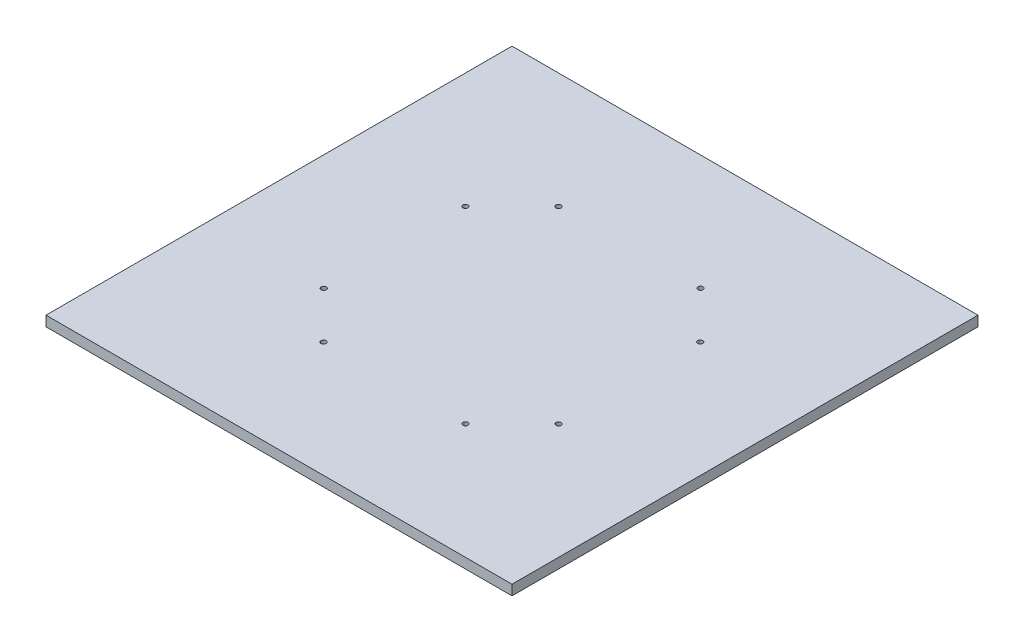
ISO-10303-21;
HEADER;
FILE_DESCRIPTION(('STEP AP214'),'2;1');
FILE_NAME('part.step','',(''),(''),'','','');
FILE_SCHEMA(('AUTOMOTIVE_DESIGN { 1 0 10303 214 1 1 1 1 }'));
ENDSEC;
DATA;
#1=APPLICATION_CONTEXT('core data for automotive mechanical design processes');
#2=APPLICATION_PROTOCOL_DEFINITION('international standard','automotive_design',2000,#1);
#3=PRODUCT_CONTEXT('',#1,'mechanical');
#4=PRODUCT('Part','Part','',(#3));
#5=PRODUCT_RELATED_PRODUCT_CATEGORY('part','',(#4));
#6=PRODUCT_DEFINITION_FORMATION('','',#4);
#7=PRODUCT_DEFINITION_CONTEXT('part definition',#1,'design');
#8=PRODUCT_DEFINITION('design','',#6,#7);
#9=PRODUCT_DEFINITION_SHAPE('','',#8);
#10=(LENGTH_UNIT() NAMED_UNIT(*) SI_UNIT(.MILLI.,.METRE.));
#11=(NAMED_UNIT(*) PLANE_ANGLE_UNIT() SI_UNIT($,.RADIAN.));
#12=(NAMED_UNIT(*) SI_UNIT($,.STERADIAN.) SOLID_ANGLE_UNIT());
#13=UNCERTAINTY_MEASURE_WITH_UNIT(LENGTH_MEASURE(1.E-05),#10,'distance_accuracy_value','');
#14=(GEOMETRIC_REPRESENTATION_CONTEXT(3) GLOBAL_UNCERTAINTY_ASSIGNED_CONTEXT((#13)) GLOBAL_UNIT_ASSIGNED_CONTEXT((#10,
#11,#12)) REPRESENTATION_CONTEXT('',''));
#15=CARTESIAN_POINT('',(0.,0.,0.));
#16=DIRECTION('',(0.,0.,1.));
#17=DIRECTION('',(1.,0.,0.));
#18=AXIS2_PLACEMENT_3D('',#15,#16,#17);
#19=CARTESIAN_POINT('',(146.05,6.35,-146.05));
#20=DIRECTION('',(-1.,0.,0.));
#21=DIRECTION('',(0.,0.,1.));
#22=AXIS2_PLACEMENT_3D('',#19,#20,#21);
#23=PLANE('',#22);
#24=DIRECTION('',(0.,0.,-1.));
#25=VECTOR('',#24,1.);
#26=CARTESIAN_POINT('',(146.05,0.,-146.05));
#27=LINE('',#26,#25);
#28=CARTESIAN_POINT('',(146.05,0.,146.05));
#29=VERTEX_POINT('',#28);
#30=CARTESIAN_POINT('',(146.05,0.,-146.05));
#31=VERTEX_POINT('',#30);
#32=EDGE_CURVE('E96',#29,#31,#27,.T.);
#33=ORIENTED_EDGE('',*,*,#32,.T.);
#34=DIRECTION('',(0.,-1.,0.));
#35=VECTOR('',#34,1.);
#36=CARTESIAN_POINT('',(146.05,6.35,-146.05));
#37=LINE('',#36,#35);
#38=CARTESIAN_POINT('',(146.05,6.35,-146.05));
#39=VERTEX_POINT('',#38);
#40=EDGE_CURVE('E11',#39,#31,#37,.T.);
#41=ORIENTED_EDGE('',*,*,#40,.F.);
#42=DIRECTION('',(0.,0.,-1.));
#43=VECTOR('',#42,1.);
#44=CARTESIAN_POINT('',(146.05,6.35,-146.05));
#45=LINE('',#44,#43);
#46=CARTESIAN_POINT('',(146.05,6.35,146.05));
#47=VERTEX_POINT('',#46);
#48=EDGE_CURVE('E84',#47,#39,#45,.T.);
#49=ORIENTED_EDGE('',*,*,#48,.F.);
#50=DIRECTION('',(0.,-1.,0.));
#51=VECTOR('',#50,1.);
#52=CARTESIAN_POINT('',(146.05,6.35,146.05));
#53=LINE('',#52,#51);
#54=EDGE_CURVE('E92',#47,#29,#53,.T.);
#55=ORIENTED_EDGE('',*,*,#54,.T.);
#56=EDGE_LOOP('',(#33,#41,#49,#55));
#57=FACE_BOUND('',#56,.T.);
#58=ADVANCED_FACE('F33',(#57),#23,.F.);
#59=CARTESIAN_POINT('',(-146.05,6.35,-146.05));
#60=DIRECTION('',(0.,0.,1.));
#61=DIRECTION('',(1.,0.,0.));
#62=AXIS2_PLACEMENT_3D('',#59,#60,#61);
#63=PLANE('',#62);
#64=DIRECTION('',(-1.,0.,0.));
#65=VECTOR('',#64,1.);
#66=CARTESIAN_POINT('',(-146.05,0.,-146.05));
#67=LINE('',#66,#65);
#68=CARTESIAN_POINT('',(-146.05,0.,-146.05));
#69=VERTEX_POINT('',#68);
#70=EDGE_CURVE('E88',#31,#69,#67,.T.);
#71=ORIENTED_EDGE('',*,*,#70,.T.);
#72=DIRECTION('',(0.,-1.,0.));
#73=VECTOR('',#72,1.);
#74=CARTESIAN_POINT('',(-146.05,6.35,-146.05));
#75=LINE('',#74,#73);
#76=CARTESIAN_POINT('',(-146.05,6.35,-146.05));
#77=VERTEX_POINT('',#76);
#78=EDGE_CURVE('E41',#77,#69,#75,.T.);
#79=ORIENTED_EDGE('',*,*,#78,.F.);
#80=DIRECTION('',(-1.,0.,0.));
#81=VECTOR('',#80,1.);
#82=CARTESIAN_POINT('',(-146.05,6.35,-146.05));
#83=LINE('',#82,#81);
#84=EDGE_CURVE('E79',#39,#77,#83,.T.);
#85=ORIENTED_EDGE('',*,*,#84,.F.);
#86=ORIENTED_EDGE('',*,*,#40,.T.);
#87=EDGE_LOOP('',(#71,#79,#85,#86));
#88=FACE_BOUND('',#87,.T.);
#89=ADVANCED_FACE('F87',(#88),#63,.F.);
#90=CARTESIAN_POINT('',(-146.05,6.35,-146.05));
#91=DIRECTION('',(1.,0.,0.));
#92=DIRECTION('',(0.,0.,-1.));
#93=AXIS2_PLACEMENT_3D('',#90,#91,#92);
#94=PLANE('',#93);
#95=DIRECTION('',(0.,0.,1.));
#96=VECTOR('',#95,1.);
#97=CARTESIAN_POINT('',(-146.05,0.,-146.05));
#98=LINE('',#97,#96);
#99=CARTESIAN_POINT('',(-146.05,0.,146.05));
#100=VERTEX_POINT('',#99);
#101=EDGE_CURVE('E66',#69,#100,#98,.T.);
#102=ORIENTED_EDGE('',*,*,#101,.T.);
#103=DIRECTION('',(0.,-1.,0.));
#104=VECTOR('',#103,1.);
#105=CARTESIAN_POINT('',(-146.05,6.35,146.05));
#106=LINE('',#105,#104);
#107=CARTESIAN_POINT('',(-146.05,6.35,146.05));
#108=VERTEX_POINT('',#107);
#109=EDGE_CURVE('E89',#108,#100,#106,.T.);
#110=ORIENTED_EDGE('',*,*,#109,.F.);
#111=DIRECTION('',(0.,0.,1.));
#112=VECTOR('',#111,1.);
#113=CARTESIAN_POINT('',(-146.05,6.35,-146.05));
#114=LINE('',#113,#112);
#115=EDGE_CURVE('E82',#77,#108,#114,.T.);
#116=ORIENTED_EDGE('',*,*,#115,.F.);
#117=ORIENTED_EDGE('',*,*,#78,.T.);
#118=EDGE_LOOP('',(#102,#110,#116,#117));
#119=FACE_BOUND('',#118,.T.);
#120=ADVANCED_FACE('F90',(#119),#94,.F.);
#121=CARTESIAN_POINT('',(-146.05,6.35,146.05));
#122=DIRECTION('',(0.,0.,-1.));
#123=DIRECTION('',(-1.,0.,0.));
#124=AXIS2_PLACEMENT_3D('',#121,#122,#123);
#125=PLANE('',#124);
#126=DIRECTION('',(1.,0.,0.));
#127=VECTOR('',#126,1.);
#128=CARTESIAN_POINT('',(-146.05,0.,146.05));
#129=LINE('',#128,#127);
#130=EDGE_CURVE('E72',#100,#29,#129,.T.);
#131=ORIENTED_EDGE('',*,*,#130,.T.);
#132=ORIENTED_EDGE('',*,*,#54,.F.);
#133=DIRECTION('',(1.,0.,0.));
#134=VECTOR('',#133,1.);
#135=CARTESIAN_POINT('',(-146.05,6.35,146.05));
#136=LINE('',#135,#134);
#137=EDGE_CURVE('E49',#108,#47,#136,.T.);
#138=ORIENTED_EDGE('',*,*,#137,.F.);
#139=ORIENTED_EDGE('',*,*,#109,.T.);
#140=EDGE_LOOP('',(#131,#132,#138,#139));
#141=FACE_BOUND('',#140,.T.);
#142=ADVANCED_FACE('F104',(#141),#125,.F.);
#143=CARTESIAN_POINT('',(0.,6.35,0.));
#144=DIRECTION('',(0.,1.,0.));
#145=DIRECTION('',(0.,0.,1.));
#146=AXIS2_PLACEMENT_3D('',#143,#144,#145);
#147=PLANE('',#146);
#148=CARTESIAN_POINT('',(-73.5699999259995,6.35,44.4300000400008));
#149=DIRECTION('',(0.,1.,0.));
#150=DIRECTION('',(-1.,0.,0.));
#151=AXIS2_PLACEMENT_3D('',#148,#149,#150);
#152=CIRCLE('',#151,1.59999997500001);
#153=CARTESIAN_POINT('',(-75.1699999009996,6.35,44.4300000400008));
#154=VERTEX_POINT('',#153);
#155=EDGE_CURVE('E152',#154,#154,#152,.T.);
#156=ORIENTED_EDGE('',*,*,#155,.F.);
#157=EDGE_LOOP('',(#156));
#158=FACE_BOUND('',#157,.T.);
#159=CARTESIAN_POINT('',(-44.4499999999992,6.35,73.6600000000005));
#160=DIRECTION('',(0.,1.,0.));
#161=DIRECTION('',(-1.,0.,0.));
#162=AXIS2_PLACEMENT_3D('',#159,#160,#161);
#163=CIRCLE('',#162,1.599999975);
#164=CARTESIAN_POINT('',(-46.0499999749992,6.35,73.6600000000005));
#165=VERTEX_POINT('',#164);
#166=EDGE_CURVE('E146',#165,#165,#163,.T.);
#167=ORIENTED_EDGE('',*,*,#166,.F.);
#168=EDGE_LOOP('',(#167));
#169=FACE_BOUND('',#168,.T.);
#170=CARTESIAN_POINT('',(-44.43000004,6.35,-73.569999926));
#171=DIRECTION('',(0.,1.,0.));
#172=DIRECTION('',(0.,0.,-1.));
#173=AXIS2_PLACEMENT_3D('',#170,#171,#172);
#174=CIRCLE('',#173,1.59999997500001);
#175=CARTESIAN_POINT('',(-44.43000004,6.35,-75.169999901));
#176=VERTEX_POINT('',#175);
#177=EDGE_CURVE('E140',#176,#176,#174,.T.);
#178=ORIENTED_EDGE('',*,*,#177,.F.);
#179=EDGE_LOOP('',(#178));
#180=FACE_BOUND('',#179,.T.);
#181=CARTESIAN_POINT('',(-73.66,6.35,-44.45));
#182=DIRECTION('',(0.,1.,0.));
#183=DIRECTION('',(0.,0.,-1.));
#184=AXIS2_PLACEMENT_3D('',#181,#182,#183);
#185=CIRCLE('',#184,1.599999975);
#186=CARTESIAN_POINT('',(-73.66,6.35,-46.049999975));
#187=VERTEX_POINT('',#186);
#188=EDGE_CURVE('E134',#187,#187,#185,.T.);
#189=ORIENTED_EDGE('',*,*,#188,.F.);
#190=EDGE_LOOP('',(#189));
#191=FACE_BOUND('',#190,.T.);
#192=CARTESIAN_POINT('',(73.5699999259999,6.35,-44.4300000400003));
#193=DIRECTION('',(0.,1.,0.));
#194=DIRECTION('',(1.,0.,0.));
#195=AXIS2_PLACEMENT_3D('',#192,#193,#194);
#196=CIRCLE('',#195,1.59999997500001);
#197=CARTESIAN_POINT('',(75.1699999009999,6.35,-44.4300000400003));
#198=VERTEX_POINT('',#197);
#199=EDGE_CURVE('E128',#198,#198,#196,.T.);
#200=ORIENTED_EDGE('',*,*,#199,.F.);
#201=EDGE_LOOP('',(#200));
#202=FACE_BOUND('',#201,.T.);
#203=CARTESIAN_POINT('',(44.4499999999998,6.35,-73.6600000000002));
#204=DIRECTION('',(0.,1.,0.));
#205=DIRECTION('',(1.,0.,0.));
#206=AXIS2_PLACEMENT_3D('',#203,#204,#205);
#207=CIRCLE('',#206,1.599999975);
#208=CARTESIAN_POINT('',(46.0499999749998,6.35,-73.6600000000002));
#209=VERTEX_POINT('',#208);
#210=EDGE_CURVE('E122',#209,#209,#207,.T.);
#211=ORIENTED_EDGE('',*,*,#210,.F.);
#212=EDGE_LOOP('',(#211));
#213=FACE_BOUND('',#212,.T.);
#214=CARTESIAN_POINT('',(44.43000004,6.35,73.569999926));
#215=DIRECTION('',(0.,1.,0.));
#216=DIRECTION('',(0.,0.,1.));
#217=AXIS2_PLACEMENT_3D('',#214,#215,#216);
#218=CIRCLE('',#217,1.59999997500001);
#219=CARTESIAN_POINT('',(44.43000004,6.35,75.169999901));
#220=VERTEX_POINT('',#219);
#221=EDGE_CURVE('E116',#220,#220,#218,.T.);
#222=ORIENTED_EDGE('',*,*,#221,.F.);
#223=EDGE_LOOP('',(#222));
#224=FACE_BOUND('',#223,.T.);
#225=CARTESIAN_POINT('',(73.66,6.35,44.45));
#226=DIRECTION('',(0.,1.,0.));
#227=DIRECTION('',(0.,0.,1.));
#228=AXIS2_PLACEMENT_3D('',#225,#226,#227);
#229=CIRCLE('',#228,1.599999975);
#230=CARTESIAN_POINT('',(73.66,6.35,46.049999975));
#231=VERTEX_POINT('',#230);
#232=EDGE_CURVE('E110',#231,#231,#229,.T.);
#233=ORIENTED_EDGE('',*,*,#232,.F.);
#234=EDGE_LOOP('',(#233));
#235=FACE_BOUND('',#234,.T.);
#236=ORIENTED_EDGE('',*,*,#48,.T.);
#237=ORIENTED_EDGE('',*,*,#84,.T.);
#238=ORIENTED_EDGE('',*,*,#115,.T.);
#239=ORIENTED_EDGE('',*,*,#137,.T.);
#240=EDGE_LOOP('',(#236,#237,#238,#239));
#241=FACE_BOUND('',#240,.T.);
#242=ADVANCED_FACE('F80',(#158,#169,#180,#191,#202,#213,#224,#235,#241),#147,.T.);
#243=CARTESIAN_POINT('',(0.,0.,0.));
#244=DIRECTION('',(0.,1.,0.));
#245=DIRECTION('',(0.,0.,1.));
#246=AXIS2_PLACEMENT_3D('',#243,#244,#245);
#247=PLANE('',#246);
#248=CARTESIAN_POINT('',(-73.5699999259995,0.,44.4300000400008));
#249=DIRECTION('',(0.,1.,0.));
#250=DIRECTION('',(-1.,0.,0.));
#251=AXIS2_PLACEMENT_3D('',#248,#249,#250);
#252=CIRCLE('',#251,1.59999997500001);
#253=CARTESIAN_POINT('',(-75.1699999009996,0.,44.4300000400008));
#254=VERTEX_POINT('',#253);
#255=EDGE_CURVE('E149',#254,#254,#252,.T.);
#256=ORIENTED_EDGE('',*,*,#255,.T.);
#257=EDGE_LOOP('',(#256));
#258=FACE_BOUND('',#257,.T.);
#259=CARTESIAN_POINT('',(-44.4499999999992,0.,73.6600000000005));
#260=DIRECTION('',(0.,1.,0.));
#261=DIRECTION('',(-1.,0.,0.));
#262=AXIS2_PLACEMENT_3D('',#259,#260,#261);
#263=CIRCLE('',#262,1.599999975);
#264=CARTESIAN_POINT('',(-46.0499999749992,0.,73.6600000000005));
#265=VERTEX_POINT('',#264);
#266=EDGE_CURVE('E143',#265,#265,#263,.T.);
#267=ORIENTED_EDGE('',*,*,#266,.T.);
#268=EDGE_LOOP('',(#267));
#269=FACE_BOUND('',#268,.T.);
#270=CARTESIAN_POINT('',(-44.43000004,0.,-73.569999926));
#271=DIRECTION('',(0.,1.,0.));
#272=DIRECTION('',(0.,0.,-1.));
#273=AXIS2_PLACEMENT_3D('',#270,#271,#272);
#274=CIRCLE('',#273,1.59999997500001);
#275=CARTESIAN_POINT('',(-44.43000004,0.,-75.169999901));
#276=VERTEX_POINT('',#275);
#277=EDGE_CURVE('E137',#276,#276,#274,.T.);
#278=ORIENTED_EDGE('',*,*,#277,.T.);
#279=EDGE_LOOP('',(#278));
#280=FACE_BOUND('',#279,.T.);
#281=CARTESIAN_POINT('',(-73.66,0.,-44.45));
#282=DIRECTION('',(0.,1.,0.));
#283=DIRECTION('',(0.,0.,-1.));
#284=AXIS2_PLACEMENT_3D('',#281,#282,#283);
#285=CIRCLE('',#284,1.599999975);
#286=CARTESIAN_POINT('',(-73.66,0.,-46.049999975));
#287=VERTEX_POINT('',#286);
#288=EDGE_CURVE('E131',#287,#287,#285,.T.);
#289=ORIENTED_EDGE('',*,*,#288,.T.);
#290=EDGE_LOOP('',(#289));
#291=FACE_BOUND('',#290,.T.);
#292=CARTESIAN_POINT('',(73.5699999259999,0.,-44.4300000400003));
#293=DIRECTION('',(0.,1.,0.));
#294=DIRECTION('',(1.,0.,0.));
#295=AXIS2_PLACEMENT_3D('',#292,#293,#294);
#296=CIRCLE('',#295,1.59999997500001);
#297=CARTESIAN_POINT('',(75.1699999009999,0.,-44.4300000400003));
#298=VERTEX_POINT('',#297);
#299=EDGE_CURVE('E125',#298,#298,#296,.T.);
#300=ORIENTED_EDGE('',*,*,#299,.T.);
#301=EDGE_LOOP('',(#300));
#302=FACE_BOUND('',#301,.T.);
#303=CARTESIAN_POINT('',(44.4499999999998,0.,-73.6600000000002));
#304=DIRECTION('',(0.,1.,0.));
#305=DIRECTION('',(1.,0.,0.));
#306=AXIS2_PLACEMENT_3D('',#303,#304,#305);
#307=CIRCLE('',#306,1.599999975);
#308=CARTESIAN_POINT('',(46.0499999749998,0.,-73.6600000000002));
#309=VERTEX_POINT('',#308);
#310=EDGE_CURVE('E119',#309,#309,#307,.T.);
#311=ORIENTED_EDGE('',*,*,#310,.T.);
#312=EDGE_LOOP('',(#311));
#313=FACE_BOUND('',#312,.T.);
#314=CARTESIAN_POINT('',(44.43000004,0.,73.569999926));
#315=DIRECTION('',(0.,1.,0.));
#316=DIRECTION('',(0.,0.,1.));
#317=AXIS2_PLACEMENT_3D('',#314,#315,#316);
#318=CIRCLE('',#317,1.59999997500001);
#319=CARTESIAN_POINT('',(44.43000004,0.,75.169999901));
#320=VERTEX_POINT('',#319);
#321=EDGE_CURVE('E113',#320,#320,#318,.T.);
#322=ORIENTED_EDGE('',*,*,#321,.T.);
#323=EDGE_LOOP('',(#322));
#324=FACE_BOUND('',#323,.T.);
#325=CARTESIAN_POINT('',(73.66,0.,44.45));
#326=DIRECTION('',(0.,1.,0.));
#327=DIRECTION('',(0.,0.,1.));
#328=AXIS2_PLACEMENT_3D('',#325,#326,#327);
#329=CIRCLE('',#328,1.599999975);
#330=CARTESIAN_POINT('',(73.66,0.,46.049999975));
#331=VERTEX_POINT('',#330);
#332=EDGE_CURVE('E99',#331,#331,#329,.T.);
#333=ORIENTED_EDGE('',*,*,#332,.T.);
#334=EDGE_LOOP('',(#333));
#335=FACE_BOUND('',#334,.T.);
#336=ORIENTED_EDGE('',*,*,#32,.F.);
#337=ORIENTED_EDGE('',*,*,#130,.F.);
#338=ORIENTED_EDGE('',*,*,#101,.F.);
#339=ORIENTED_EDGE('',*,*,#70,.F.);
#340=EDGE_LOOP('',(#336,#337,#338,#339));
#341=FACE_BOUND('',#340,.T.);
#342=ADVANCED_FACE('F107',(#258,#269,#280,#291,#302,#313,#324,#335,#341),#247,.F.);
#343=CARTESIAN_POINT('',(73.66,0.,44.45));
#344=DIRECTION('',(0.,1.,0.));
#345=DIRECTION('',(0.,0.,1.));
#346=AXIS2_PLACEMENT_3D('',#343,#344,#345);
#347=CYLINDRICAL_SURFACE('',#346,1.599999975);
#348=ORIENTED_EDGE('',*,*,#332,.F.);
#349=EDGE_LOOP('',(#348));
#350=FACE_BOUND('',#349,.T.);
#351=ORIENTED_EDGE('',*,*,#232,.T.);
#352=EDGE_LOOP('',(#351));
#353=FACE_BOUND('',#352,.T.);
#354=ADVANCED_FACE('F184',(#350,#353),#347,.F.);
#355=CARTESIAN_POINT('',(44.43000004,0.,73.569999926));
#356=DIRECTION('',(0.,1.,0.));
#357=DIRECTION('',(0.,0.,1.));
#358=AXIS2_PLACEMENT_3D('',#355,#356,#357);
#359=CYLINDRICAL_SURFACE('',#358,1.59999997500001);
#360=ORIENTED_EDGE('',*,*,#321,.F.);
#361=EDGE_LOOP('',(#360));
#362=FACE_BOUND('',#361,.T.);
#363=ORIENTED_EDGE('',*,*,#221,.T.);
#364=EDGE_LOOP('',(#363));
#365=FACE_BOUND('',#364,.T.);
#366=ADVANCED_FACE('F186',(#362,#365),#359,.F.);
#367=CARTESIAN_POINT('',(44.4499999999998,0.,-73.6600000000002));
#368=DIRECTION('',(0.,1.,0.));
#369=DIRECTION('',(0.,0.,1.));
#370=AXIS2_PLACEMENT_3D('',#367,#368,#369);
#371=CYLINDRICAL_SURFACE('',#370,1.599999975);
#372=ORIENTED_EDGE('',*,*,#310,.F.);
#373=EDGE_LOOP('',(#372));
#374=FACE_BOUND('',#373,.T.);
#375=ORIENTED_EDGE('',*,*,#210,.T.);
#376=EDGE_LOOP('',(#375));
#377=FACE_BOUND('',#376,.T.);
#378=ADVANCED_FACE('F193',(#374,#377),#371,.F.);
#379=CARTESIAN_POINT('',(73.5699999259999,0.,-44.4300000400003));
#380=DIRECTION('',(0.,1.,0.));
#381=DIRECTION('',(0.,0.,1.));
#382=AXIS2_PLACEMENT_3D('',#379,#380,#381);
#383=CYLINDRICAL_SURFACE('',#382,1.59999997500001);
#384=ORIENTED_EDGE('',*,*,#299,.F.);
#385=EDGE_LOOP('',(#384));
#386=FACE_BOUND('',#385,.T.);
#387=ORIENTED_EDGE('',*,*,#199,.T.);
#388=EDGE_LOOP('',(#387));
#389=FACE_BOUND('',#388,.T.);
#390=ADVANCED_FACE('F231',(#386,#389),#383,.F.);
#391=CARTESIAN_POINT('',(-73.66,0.,-44.45));
#392=DIRECTION('',(0.,1.,0.));
#393=DIRECTION('',(0.,0.,1.));
#394=AXIS2_PLACEMENT_3D('',#391,#392,#393);
#395=CYLINDRICAL_SURFACE('',#394,1.599999975);
#396=ORIENTED_EDGE('',*,*,#288,.F.);
#397=EDGE_LOOP('',(#396));
#398=FACE_BOUND('',#397,.T.);
#399=ORIENTED_EDGE('',*,*,#188,.T.);
#400=EDGE_LOOP('',(#399));
#401=FACE_BOUND('',#400,.T.);
#402=ADVANCED_FACE('F242',(#398,#401),#395,.F.);
#403=CARTESIAN_POINT('',(-44.43000004,0.,-73.569999926));
#404=DIRECTION('',(0.,1.,0.));
#405=DIRECTION('',(0.,0.,1.));
#406=AXIS2_PLACEMENT_3D('',#403,#404,#405);
#407=CYLINDRICAL_SURFACE('',#406,1.59999997500001);
#408=ORIENTED_EDGE('',*,*,#277,.F.);
#409=EDGE_LOOP('',(#408));
#410=FACE_BOUND('',#409,.T.);
#411=ORIENTED_EDGE('',*,*,#177,.T.);
#412=EDGE_LOOP('',(#411));
#413=FACE_BOUND('',#412,.T.);
#414=ADVANCED_FACE('F252',(#410,#413),#407,.F.);
#415=CARTESIAN_POINT('',(-44.4499999999992,0.,73.6600000000005));
#416=DIRECTION('',(0.,1.,0.));
#417=DIRECTION('',(0.,0.,1.));
#418=AXIS2_PLACEMENT_3D('',#415,#416,#417);
#419=CYLINDRICAL_SURFACE('',#418,1.599999975);
#420=ORIENTED_EDGE('',*,*,#266,.F.);
#421=EDGE_LOOP('',(#420));
#422=FACE_BOUND('',#421,.T.);
#423=ORIENTED_EDGE('',*,*,#166,.T.);
#424=EDGE_LOOP('',(#423));
#425=FACE_BOUND('',#424,.T.);
#426=ADVANCED_FACE('F163',(#422,#425),#419,.F.);
#427=CARTESIAN_POINT('',(-73.5699999259995,0.,44.4300000400008));
#428=DIRECTION('',(0.,1.,0.));
#429=DIRECTION('',(0.,0.,1.));
#430=AXIS2_PLACEMENT_3D('',#427,#428,#429);
#431=CYLINDRICAL_SURFACE('',#430,1.59999997500001);
#432=ORIENTED_EDGE('',*,*,#255,.F.);
#433=EDGE_LOOP('',(#432));
#434=FACE_BOUND('',#433,.T.);
#435=ORIENTED_EDGE('',*,*,#155,.T.);
#436=EDGE_LOOP('',(#435));
#437=FACE_BOUND('',#436,.T.);
#438=ADVANCED_FACE('F160',(#434,#437),#431,.F.);
#439=CLOSED_SHELL('',(#58,#89,#120,#142,#242,#342,#354,#366,#378,#390,#402,#414,#426,#438));
#440=MANIFOLD_SOLID_BREP('B2',#439);
#441=ADVANCED_BREP_SHAPE_REPRESENTATION('',(#18,#440),#14);
#442=SHAPE_DEFINITION_REPRESENTATION(#9,#441);
ENDSEC;
END-ISO-10303-21;
